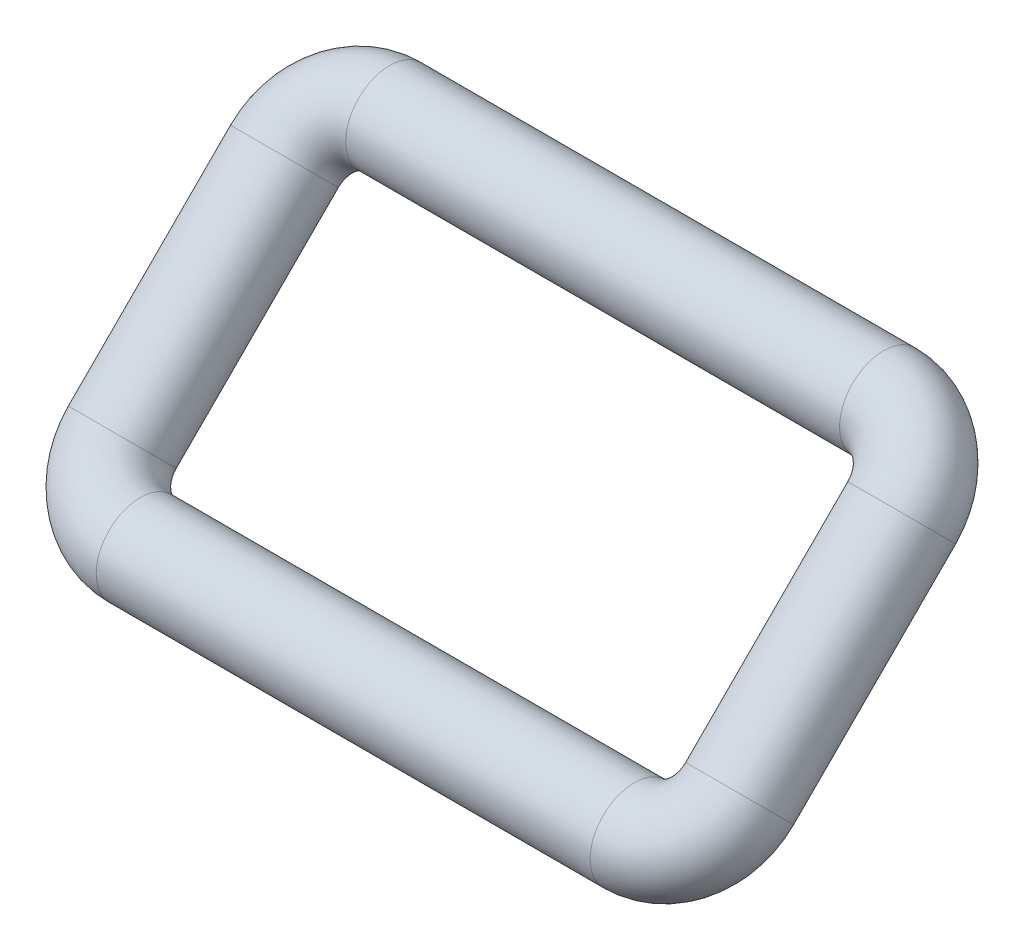
ISO-10303-21;
HEADER;
FILE_DESCRIPTION(('STEP AP214'),'2;1');
FILE_NAME('part.step','',(''),(''),'','','');
FILE_SCHEMA(('AUTOMOTIVE_DESIGN { 1 0 10303 214 1 1 1 1 }'));
ENDSEC;
DATA;
#1=APPLICATION_CONTEXT('core data for automotive mechanical design processes');
#2=APPLICATION_PROTOCOL_DEFINITION('international standard','automotive_design',2000,#1);
#3=PRODUCT_CONTEXT('',#1,'mechanical');
#4=PRODUCT('Part','Part','',(#3));
#5=PRODUCT_RELATED_PRODUCT_CATEGORY('part','',(#4));
#6=PRODUCT_DEFINITION_FORMATION('','',#4);
#7=PRODUCT_DEFINITION_CONTEXT('part definition',#1,'design');
#8=PRODUCT_DEFINITION('design','',#6,#7);
#9=PRODUCT_DEFINITION_SHAPE('','',#8);
#10=(LENGTH_UNIT() NAMED_UNIT(*) SI_UNIT(.MILLI.,.METRE.));
#11=(NAMED_UNIT(*) PLANE_ANGLE_UNIT() SI_UNIT($,.RADIAN.));
#12=(NAMED_UNIT(*) SI_UNIT($,.STERADIAN.) SOLID_ANGLE_UNIT());
#13=UNCERTAINTY_MEASURE_WITH_UNIT(LENGTH_MEASURE(1.E-05),#10,'distance_accuracy_value','');
#14=(GEOMETRIC_REPRESENTATION_CONTEXT(3) GLOBAL_UNCERTAINTY_ASSIGNED_CONTEXT((#13)) GLOBAL_UNIT_ASSIGNED_CONTEXT((#10,
#11,#12)) REPRESENTATION_CONTEXT('',''));
#15=CARTESIAN_POINT('',(0.,0.,0.));
#16=DIRECTION('',(0.,0.,1.));
#17=DIRECTION('',(1.,0.,0.));
#18=AXIS2_PLACEMENT_3D('',#15,#16,#17);
#19=CARTESIAN_POINT('',(5.24,-14.6357592315986,16.23066255168));
#20=DIRECTION('',(0.,0.707106781186539,-0.707106781186556));
#21=DIRECTION('',(-1.,0.,0.));
#22=AXIS2_PLACEMENT_3D('',#19,#20,#21);
#23=CYLINDRICAL_SURFACE('',#22,0.6);
#24=CARTESIAN_POINT('',(5.24,-12.4295860742966,14.024489394378));
#25=DIRECTION('',(0.,-0.707106781186539,0.707106781186556));
#26=DIRECTION('',(1.,0.,0.));
#27=AXIS2_PLACEMENT_3D('',#24,#25,#26);
#28=CIRCLE('',#27,0.6);
#29=CARTESIAN_POINT('',(5.84,-12.4295860742966,14.024489394378));
#30=VERTEX_POINT('',#29);
#31=EDGE_CURVE('E79',#30,#30,#28,.T.);
#32=ORIENTED_EDGE('',*,*,#31,.T.);
#33=DIRECTION('',(0.,-0.707106781186539,0.707106781186556));
#34=VECTOR('',#33,1.);
#35=CARTESIAN_POINT('',(5.84,-14.6357592315986,16.23066255168));
#36=LINE('',#35,#34);
#37=CARTESIAN_POINT('',(5.84,-14.6357592315986,16.23066255168));
#38=VERTEX_POINT('',#37);
#39=EDGE_CURVE('E11',#30,#38,#36,.T.);
#40=ORIENTED_EDGE('',*,*,#39,.T.);
#41=CARTESIAN_POINT('',(5.24,-14.6357592315986,16.23066255168));
#42=DIRECTION('',(0.,-0.707106781186539,0.707106781186556));
#43=DIRECTION('',(1.,0.,0.));
#44=AXIS2_PLACEMENT_3D('',#41,#42,#43);
#45=CIRCLE('',#44,0.6);
#46=EDGE_CURVE('E81',#38,#38,#45,.T.);
#47=ORIENTED_EDGE('',*,*,#46,.F.);
#48=ORIENTED_EDGE('',*,*,#39,.F.);
#49=EDGE_LOOP('',(#32,#40,#47,#48));
#50=FACE_BOUND('',#49,.T.);
#51=ADVANCED_FACE('F16',(#50),#23,.T.);
#52=CARTESIAN_POINT('',(6.08,-11.8356163780999,13.4305196981813));
#53=DIRECTION('',(1.,0.,0.));
#54=DIRECTION('',(0.,0.707106781186539,-0.707106781186556));
#55=AXIS2_PLACEMENT_3D('',#52,#53,#54);
#56=CYLINDRICAL_SURFACE('',#55,0.6);
#57=CARTESIAN_POINT('',(12.8,-11.8356163780999,13.4305196981813));
#58=DIRECTION('',(-1.,0.,0.));
#59=DIRECTION('',(0.,-0.707106781186539,0.707106781186556));
#60=AXIS2_PLACEMENT_3D('',#57,#58,#59);
#61=CIRCLE('',#60,0.6);
#62=CARTESIAN_POINT('',(12.8,-12.2598804468119,13.8547837668932));
#63=VERTEX_POINT('',#62);
#64=EDGE_CURVE('E131',#63,#63,#61,.T.);
#65=ORIENTED_EDGE('',*,*,#64,.T.);
#66=DIRECTION('',(-1.,0.,0.));
#67=VECTOR('',#66,1.);
#68=CARTESIAN_POINT('',(6.08,-12.2598804468119,13.8547837668932));
#69=LINE('',#68,#67);
#70=CARTESIAN_POINT('',(6.08,-12.2598804468119,13.8547837668932));
#71=VERTEX_POINT('',#70);
#72=EDGE_CURVE('E26',#63,#71,#69,.T.);
#73=ORIENTED_EDGE('',*,*,#72,.T.);
#74=CARTESIAN_POINT('',(6.08,-11.8356163780999,13.4305196981813));
#75=DIRECTION('',(-1.,0.,0.));
#76=DIRECTION('',(0.,-0.707106781186539,0.707106781186556));
#77=AXIS2_PLACEMENT_3D('',#74,#75,#76);
#78=CIRCLE('',#77,0.6);
#79=EDGE_CURVE('E108',#71,#71,#78,.T.);
#80=ORIENTED_EDGE('',*,*,#79,.F.);
#81=ORIENTED_EDGE('',*,*,#72,.F.);
#82=EDGE_LOOP('',(#65,#73,#80,#81));
#83=FACE_BOUND('',#82,.T.);
#84=ADVANCED_FACE('F18',(#83),#56,.T.);
#85=CARTESIAN_POINT('',(13.64,-12.4295860742966,14.024489394378));
#86=DIRECTION('',(0.,-0.707106781186539,0.707106781186556));
#87=DIRECTION('',(1.,0.,0.));
#88=AXIS2_PLACEMENT_3D('',#85,#86,#87);
#89=CYLINDRICAL_SURFACE('',#88,0.6);
#90=CARTESIAN_POINT('',(13.64,-14.6357592315986,16.23066255168));
#91=DIRECTION('',(0.,0.707106781186539,-0.707106781186556));
#92=DIRECTION('',(-1.,0.,0.));
#93=AXIS2_PLACEMENT_3D('',#90,#91,#92);
#94=CIRCLE('',#93,0.6);
#95=CARTESIAN_POINT('',(13.04,-14.6357592315986,16.23066255168));
#96=VERTEX_POINT('',#95);
#97=EDGE_CURVE('E152',#96,#96,#94,.T.);
#98=ORIENTED_EDGE('',*,*,#97,.T.);
#99=DIRECTION('',(0.,0.707106781186539,-0.707106781186556));
#100=VECTOR('',#99,1.);
#101=CARTESIAN_POINT('',(13.04,-12.4295860742966,14.024489394378));
#102=LINE('',#101,#100);
#103=CARTESIAN_POINT('',(13.04,-12.4295860742966,14.024489394378));
#104=VERTEX_POINT('',#103);
#105=EDGE_CURVE('E59',#96,#104,#102,.T.);
#106=ORIENTED_EDGE('',*,*,#105,.T.);
#107=CARTESIAN_POINT('',(13.64,-12.4295860742966,14.024489394378));
#108=DIRECTION('',(0.,0.707106781186539,-0.707106781186556));
#109=DIRECTION('',(-1.,0.,0.));
#110=AXIS2_PLACEMENT_3D('',#107,#108,#109);
#111=CIRCLE('',#110,0.6);
#112=EDGE_CURVE('E146',#104,#104,#111,.T.);
#113=ORIENTED_EDGE('',*,*,#112,.F.);
#114=ORIENTED_EDGE('',*,*,#105,.F.);
#115=EDGE_LOOP('',(#98,#106,#113,#114));
#116=FACE_BOUND('',#115,.T.);
#117=ADVANCED_FACE('F188',(#116),#89,.T.);
#118=CARTESIAN_POINT('',(12.8,-15.2297289277953,16.8246322478767));
#119=DIRECTION('',(-1.,0.,0.));
#120=DIRECTION('',(0.,-0.707106781186539,0.707106781186556));
#121=AXIS2_PLACEMENT_3D('',#118,#119,#120);
#122=CYLINDRICAL_SURFACE('',#121,0.6);
#123=CARTESIAN_POINT('',(6.08,-15.2297289277953,16.8246322478767));
#124=DIRECTION('',(1.,0.,0.));
#125=DIRECTION('',(0.,0.707106781186539,-0.707106781186556));
#126=AXIS2_PLACEMENT_3D('',#123,#124,#125);
#127=CIRCLE('',#126,0.6);
#128=CARTESIAN_POINT('',(6.08,-14.8054648590834,16.4003681791648));
#129=VERTEX_POINT('',#128);
#130=EDGE_CURVE('E88',#129,#129,#127,.T.);
#131=ORIENTED_EDGE('',*,*,#130,.T.);
#132=DIRECTION('',(1.,0.,0.));
#133=VECTOR('',#132,1.);
#134=CARTESIAN_POINT('',(12.8,-14.8054648590834,16.4003681791648));
#135=LINE('',#134,#133);
#136=CARTESIAN_POINT('',(12.8,-14.8054648590834,16.4003681791648));
#137=VERTEX_POINT('',#136);
#138=EDGE_CURVE('E39',#129,#137,#135,.T.);
#139=ORIENTED_EDGE('',*,*,#138,.T.);
#140=CARTESIAN_POINT('',(12.8,-15.2297289277953,16.8246322478767));
#141=DIRECTION('',(1.,0.,0.));
#142=DIRECTION('',(0.,0.707106781186539,-0.707106781186556));
#143=AXIS2_PLACEMENT_3D('',#140,#141,#142);
#144=CIRCLE('',#143,0.6);
#145=EDGE_CURVE('E109',#137,#137,#144,.T.);
#146=ORIENTED_EDGE('',*,*,#145,.F.);
#147=ORIENTED_EDGE('',*,*,#138,.F.);
#148=EDGE_LOOP('',(#131,#139,#146,#147));
#149=FACE_BOUND('',#148,.T.);
#150=ADVANCED_FACE('F228',(#149),#122,.T.);
#151=CARTESIAN_POINT('',(6.08,-14.6357592315986,16.23066255168));
#152=DIRECTION('',(0.,-0.707106781186556,-0.707106781186539));
#153=DIRECTION('',(0.,0.707106781186539,-0.707106781186556));
#154=AXIS2_PLACEMENT_3D('',#151,#152,#153);
#155=TOROIDAL_SURFACE('',#154,0.84,0.6);
#156=ORIENTED_EDGE('',*,*,#46,.T.);
#157=CARTESIAN_POINT('',(6.08,-14.6357592315986,16.23066255168));
#158=DIRECTION('',(0.,0.707106781186556,0.707106781186539));
#159=DIRECTION('',(0.,0.707106781186539,-0.707106781186556));
#160=AXIS2_PLACEMENT_3D('',#157,#158,#159);
#161=CIRCLE('',#160,0.24);
#162=EDGE_CURVE('E86',#38,#129,#161,.T.);
#163=ORIENTED_EDGE('',*,*,#162,.T.);
#164=ORIENTED_EDGE('',*,*,#130,.F.);
#165=ORIENTED_EDGE('',*,*,#162,.F.);
#166=EDGE_LOOP('',(#156,#163,#164,#165));
#167=FACE_BOUND('',#166,.T.);
#168=ADVANCED_FACE('F87',(#167),#155,.T.);
#169=CARTESIAN_POINT('',(6.08,-12.4295860742966,14.024489394378));
#170=DIRECTION('',(0.,-0.707106781186556,-0.707106781186539));
#171=DIRECTION('',(0.,0.707106781186539,-0.707106781186556));
#172=AXIS2_PLACEMENT_3D('',#169,#170,#171);
#173=TOROIDAL_SURFACE('',#172,0.84,0.6);
#174=ORIENTED_EDGE('',*,*,#79,.T.);
#175=CARTESIAN_POINT('',(6.08,-12.4295860742966,14.024489394378));
#176=DIRECTION('',(0.,0.707106781186556,0.707106781186539));
#177=DIRECTION('',(0.,0.707106781186539,-0.707106781186556));
#178=AXIS2_PLACEMENT_3D('',#175,#176,#177);
#179=CIRCLE('',#178,0.24);
#180=EDGE_CURVE('E104',#71,#30,#179,.T.);
#181=ORIENTED_EDGE('',*,*,#180,.T.);
#182=ORIENTED_EDGE('',*,*,#31,.F.);
#183=ORIENTED_EDGE('',*,*,#180,.F.);
#184=EDGE_LOOP('',(#174,#181,#182,#183));
#185=FACE_BOUND('',#184,.T.);
#186=ADVANCED_FACE('F201',(#185),#173,.T.);
#187=CARTESIAN_POINT('',(12.8,-12.4295860742966,14.024489394378));
#188=DIRECTION('',(0.,-0.707106781186556,-0.707106781186539));
#189=DIRECTION('',(0.,0.707106781186539,-0.707106781186556));
#190=AXIS2_PLACEMENT_3D('',#187,#188,#189);
#191=TOROIDAL_SURFACE('',#190,0.84,0.6);
#192=ORIENTED_EDGE('',*,*,#112,.T.);
#193=CARTESIAN_POINT('',(12.8,-12.4295860742966,14.024489394378));
#194=DIRECTION('',(0.,0.707106781186556,0.707106781186539));
#195=DIRECTION('',(0.,0.707106781186539,-0.707106781186556));
#196=AXIS2_PLACEMENT_3D('',#193,#194,#195);
#197=CIRCLE('',#196,0.24);
#198=EDGE_CURVE('E100',#104,#63,#197,.T.);
#199=ORIENTED_EDGE('',*,*,#198,.T.);
#200=ORIENTED_EDGE('',*,*,#64,.F.);
#201=ORIENTED_EDGE('',*,*,#198,.F.);
#202=EDGE_LOOP('',(#192,#199,#200,#201));
#203=FACE_BOUND('',#202,.T.);
#204=ADVANCED_FACE('F196',(#203),#191,.T.);
#205=CARTESIAN_POINT('',(12.8,-14.6357592315986,16.23066255168));
#206=DIRECTION('',(0.,-0.707106781186556,-0.707106781186539));
#207=DIRECTION('',(0.,0.707106781186539,-0.707106781186556));
#208=AXIS2_PLACEMENT_3D('',#205,#206,#207);
#209=TOROIDAL_SURFACE('',#208,0.84,0.6);
#210=ORIENTED_EDGE('',*,*,#145,.T.);
#211=CARTESIAN_POINT('',(12.8,-14.6357592315986,16.23066255168));
#212=DIRECTION('',(0.,0.707106781186556,0.707106781186539));
#213=DIRECTION('',(0.,0.707106781186539,-0.707106781186556));
#214=AXIS2_PLACEMENT_3D('',#211,#212,#213);
#215=CIRCLE('',#214,0.24);
#216=EDGE_CURVE('E112',#137,#96,#215,.T.);
#217=ORIENTED_EDGE('',*,*,#216,.T.);
#218=ORIENTED_EDGE('',*,*,#97,.F.);
#219=ORIENTED_EDGE('',*,*,#216,.F.);
#220=EDGE_LOOP('',(#210,#217,#218,#219));
#221=FACE_BOUND('',#220,.T.);
#222=ADVANCED_FACE('F192',(#221),#209,.T.);
#223=CLOSED_SHELL('',(#51,#84,#117,#150,#168,#186,#204,#222));
#224=MANIFOLD_SOLID_BREP('B1',#223);
#225=ADVANCED_BREP_SHAPE_REPRESENTATION('',(#18,#224),#14);
#226=SHAPE_DEFINITION_REPRESENTATION(#9,#225);
ENDSEC;
END-ISO-10303-21;
